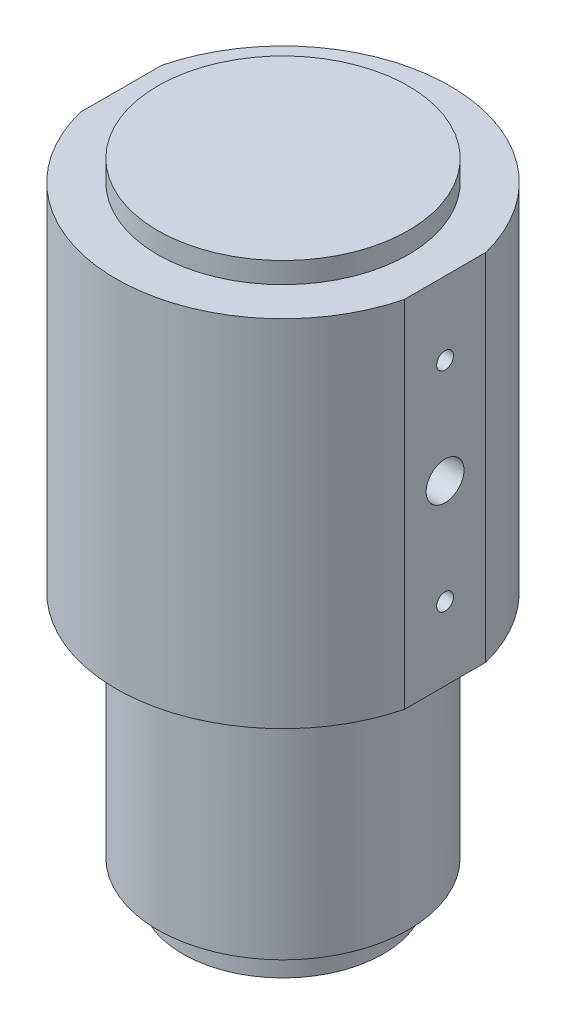
ISO-10303-21;
HEADER;
FILE_DESCRIPTION(('STEP AP214'),'2;1');
FILE_NAME('part.step','',(''),(''),'','','');
FILE_SCHEMA(('AUTOMOTIVE_DESIGN { 1 0 10303 214 1 1 1 1 }'));
ENDSEC;
DATA;
#1=APPLICATION_CONTEXT('core data for automotive mechanical design processes');
#2=APPLICATION_PROTOCOL_DEFINITION('international standard','automotive_design',2000,#1);
#3=PRODUCT_CONTEXT('',#1,'mechanical');
#4=PRODUCT('Part','Part','',(#3));
#5=PRODUCT_RELATED_PRODUCT_CATEGORY('part','',(#4));
#6=PRODUCT_DEFINITION_FORMATION('','',#4);
#7=PRODUCT_DEFINITION_CONTEXT('part definition',#1,'design');
#8=PRODUCT_DEFINITION('design','',#6,#7);
#9=PRODUCT_DEFINITION_SHAPE('','',#8);
#10=(LENGTH_UNIT() NAMED_UNIT(*) SI_UNIT(.MILLI.,.METRE.));
#11=(NAMED_UNIT(*) PLANE_ANGLE_UNIT() SI_UNIT($,.RADIAN.));
#12=(NAMED_UNIT(*) SI_UNIT($,.STERADIAN.) SOLID_ANGLE_UNIT());
#13=UNCERTAINTY_MEASURE_WITH_UNIT(LENGTH_MEASURE(1.E-05),#10,'distance_accuracy_value','');
#14=(GEOMETRIC_REPRESENTATION_CONTEXT(3) GLOBAL_UNCERTAINTY_ASSIGNED_CONTEXT((#13)) GLOBAL_UNIT_ASSIGNED_CONTEXT((#10,
#11,#12)) REPRESENTATION_CONTEXT('',''));
#15=CARTESIAN_POINT('',(0.,0.,0.));
#16=DIRECTION('',(0.,0.,1.));
#17=DIRECTION('',(1.,0.,0.));
#18=AXIS2_PLACEMENT_3D('',#15,#16,#17);
#19=CARTESIAN_POINT('',(0.,0.,0.));
#20=DIRECTION('',(0.,1.,0.));
#21=DIRECTION('',(0.,0.,1.));
#22=AXIS2_PLACEMENT_3D('',#19,#20,#21);
#23=PLANE('',#22);
#24=CARTESIAN_POINT('',(0.,0.,0.));
#25=DIRECTION('',(0.,1.,0.));
#26=DIRECTION('',(0.,0.,1.));
#27=AXIS2_PLACEMENT_3D('',#24,#25,#26);
#28=CIRCLE('',#27,38.1);
#29=CARTESIAN_POINT('',(0.,0.,38.1));
#30=VERTEX_POINT('',#29);
#31=EDGE_CURVE('E99',#30,#30,#28,.F.);
#32=ORIENTED_EDGE('',*,*,#31,.F.);
#33=EDGE_LOOP('',(#32));
#34=FACE_BOUND('',#33,.T.);
#35=DIRECTION('',(0.,0.,1.));
#36=VECTOR('',#35,1.);
#37=CARTESIAN_POINT('',(-49.276,0.,-63.5));
#38=LINE('',#37,#36);
#39=CARTESIAN_POINT('',(-49.276,0.,-12.3497297136416));
#40=VERTEX_POINT('',#39);
#41=CARTESIAN_POINT('',(-49.276,0.,12.3497297136416));
#42=VERTEX_POINT('',#41);
#43=EDGE_CURVE('E51',#40,#42,#38,.T.);
#44=ORIENTED_EDGE('',*,*,#43,.F.);
#45=CARTESIAN_POINT('',(0.,0.,0.));
#46=DIRECTION('',(0.,1.,0.));
#47=DIRECTION('',(0.,0.,1.));
#48=AXIS2_PLACEMENT_3D('',#45,#46,#47);
#49=CIRCLE('',#48,50.8);
#50=CARTESIAN_POINT('',(49.276,0.,-12.3497297136414));
#51=VERTEX_POINT('',#50);
#52=EDGE_CURVE('E97',#51,#40,#49,.T.);
#53=ORIENTED_EDGE('',*,*,#52,.F.);
#54=DIRECTION('',(0.,0.,-1.));
#55=VECTOR('',#54,1.);
#56=CARTESIAN_POINT('',(49.276,0.,-63.5));
#57=LINE('',#56,#55);
#58=CARTESIAN_POINT('',(49.276,0.,12.3497297136414));
#59=VERTEX_POINT('',#58);
#60=EDGE_CURVE('E59',#59,#51,#57,.T.);
#61=ORIENTED_EDGE('',*,*,#60,.F.);
#62=EDGE_CURVE('E92',#42,#59,#49,.T.);
#63=ORIENTED_EDGE('',*,*,#62,.F.);
#64=EDGE_LOOP('',(#44,#53,#61,#63));
#65=FACE_BOUND('',#64,.T.);
#66=ADVANCED_FACE('F37',(#34,#65),#23,.F.);
#67=CARTESIAN_POINT('',(0.,107.95,0.));
#68=DIRECTION('',(0.,1.,0.));
#69=DIRECTION('',(0.,0.,1.));
#70=AXIS2_PLACEMENT_3D('',#67,#68,#69);
#71=PLANE('',#70);
#72=CARTESIAN_POINT('',(0.,107.95,0.));
#73=DIRECTION('',(0.,1.,0.));
#74=DIRECTION('',(0.,0.,1.));
#75=AXIS2_PLACEMENT_3D('',#72,#73,#74);
#76=CIRCLE('',#75,38.1);
#77=CARTESIAN_POINT('',(0.,107.95,38.1));
#78=VERTEX_POINT('',#77);
#79=EDGE_CURVE('E103',#78,#78,#76,.T.);
#80=ORIENTED_EDGE('',*,*,#79,.F.);
#81=EDGE_LOOP('',(#80));
#82=FACE_BOUND('',#81,.T.);
#83=CARTESIAN_POINT('',(0.,107.95,0.));
#84=DIRECTION('',(0.,1.,0.));
#85=DIRECTION('',(0.,0.,1.));
#86=AXIS2_PLACEMENT_3D('',#83,#84,#85);
#87=CIRCLE('',#86,50.8);
#88=CARTESIAN_POINT('',(49.276,107.95,-12.3497297136414));
#89=VERTEX_POINT('',#88);
#90=CARTESIAN_POINT('',(-49.276,107.95,-12.3497297136416));
#91=VERTEX_POINT('',#90);
#92=EDGE_CURVE('E96',#89,#91,#87,.T.);
#93=ORIENTED_EDGE('',*,*,#92,.T.);
#94=DIRECTION('',(0.,0.,1.));
#95=VECTOR('',#94,1.);
#96=CARTESIAN_POINT('',(-49.276,107.95,-63.5));
#97=LINE('',#96,#95);
#98=CARTESIAN_POINT('',(-49.276,107.95,12.3497297136416));
#99=VERTEX_POINT('',#98);
#100=EDGE_CURVE('E84',#91,#99,#97,.T.);
#101=ORIENTED_EDGE('',*,*,#100,.T.);
#102=CARTESIAN_POINT('',(49.276,107.95,12.3497297136414));
#103=VERTEX_POINT('',#102);
#104=EDGE_CURVE('E90',#99,#103,#87,.T.);
#105=ORIENTED_EDGE('',*,*,#104,.T.);
#106=DIRECTION('',(0.,0.,-1.));
#107=VECTOR('',#106,1.);
#108=CARTESIAN_POINT('',(49.276,107.95,-63.5));
#109=LINE('',#108,#107);
#110=EDGE_CURVE('E75',#103,#89,#109,.T.);
#111=ORIENTED_EDGE('',*,*,#110,.T.);
#112=EDGE_LOOP('',(#93,#101,#105,#111));
#113=FACE_BOUND('',#112,.T.);
#114=ADVANCED_FACE('F95',(#82,#113),#71,.T.);
#115=CARTESIAN_POINT('',(0.,107.95,0.));
#116=DIRECTION('',(0.,-1.,0.));
#117=DIRECTION('',(0.,0.,-1.));
#118=AXIS2_PLACEMENT_3D('',#115,#116,#117);
#119=CYLINDRICAL_SURFACE('',#118,50.8);
#120=DIRECTION('',(0.,-1.,0.));
#121=VECTOR('',#120,1.);
#122=CARTESIAN_POINT('',(-49.276,107.95,-12.3497297136416));
#123=LINE('',#122,#121);
#124=EDGE_CURVE('E12',#91,#40,#123,.T.);
#125=ORIENTED_EDGE('',*,*,#124,.F.);
#126=ORIENTED_EDGE('',*,*,#92,.F.);
#127=DIRECTION('',(0.,-1.,0.));
#128=VECTOR('',#127,1.);
#129=CARTESIAN_POINT('',(49.276,107.95,-12.3497297136414));
#130=LINE('',#129,#128);
#131=EDGE_CURVE('E79',#51,#89,#130,.F.);
#132=ORIENTED_EDGE('',*,*,#131,.F.);
#133=ORIENTED_EDGE('',*,*,#52,.T.);
#134=EDGE_LOOP('',(#125,#126,#132,#133));
#135=FACE_BOUND('',#134,.T.);
#136=ADVANCED_FACE('F39',(#135),#119,.T.);
#137=DIRECTION('',(0.,-1.,0.));
#138=VECTOR('',#137,1.);
#139=CARTESIAN_POINT('',(-49.276,107.95,12.3497297136416));
#140=LINE('',#139,#138);
#141=EDGE_CURVE('E45',#42,#99,#140,.F.);
#142=ORIENTED_EDGE('',*,*,#141,.F.);
#143=ORIENTED_EDGE('',*,*,#62,.T.);
#144=DIRECTION('',(0.,-1.,0.));
#145=VECTOR('',#144,1.);
#146=CARTESIAN_POINT('',(49.276,107.95,12.3497297136414));
#147=LINE('',#146,#145);
#148=EDGE_CURVE('E78',#103,#59,#147,.T.);
#149=ORIENTED_EDGE('',*,*,#148,.F.);
#150=ORIENTED_EDGE('',*,*,#104,.F.);
#151=EDGE_LOOP('',(#142,#143,#149,#150));
#152=FACE_BOUND('',#151,.T.);
#153=ADVANCED_FACE('F89',(#152),#119,.T.);
#154=CARTESIAN_POINT('',(0.,-69.85,0.));
#155=DIRECTION('',(0.,-1.,0.));
#156=DIRECTION('',(0.,0.,-1.));
#157=AXIS2_PLACEMENT_3D('',#154,#155,#156);
#158=PLANE('',#157);
#159=CARTESIAN_POINT('',(0.,-69.85,0.));
#160=DIRECTION('',(0.,-1.,0.));
#161=DIRECTION('',(0.,0.,-1.));
#162=AXIS2_PLACEMENT_3D('',#159,#160,#161);
#163=CIRCLE('',#162,38.1);
#164=CARTESIAN_POINT('',(0.,-69.85,-38.1));
#165=VERTEX_POINT('',#164);
#166=EDGE_CURVE('E129',#165,#165,#163,.T.);
#167=ORIENTED_EDGE('',*,*,#166,.T.);
#168=EDGE_LOOP('',(#167));
#169=FACE_BOUND('',#168,.T.);
#170=CARTESIAN_POINT('',(0.,-69.85,0.));
#171=DIRECTION('',(0.,-1.,0.));
#172=DIRECTION('',(0.,0.,-1.));
#173=AXIS2_PLACEMENT_3D('',#170,#171,#172);
#174=CIRCLE('',#173,30.48);
#175=CARTESIAN_POINT('',(0.,-69.85,-30.48));
#176=VERTEX_POINT('',#175);
#177=EDGE_CURVE('E124',#176,#176,#174,.T.);
#178=ORIENTED_EDGE('',*,*,#177,.F.);
#179=EDGE_LOOP('',(#178));
#180=FACE_BOUND('',#179,.T.);
#181=ADVANCED_FACE('F153',(#169,#180),#158,.T.);
#182=CARTESIAN_POINT('',(0.,114.3,0.));
#183=DIRECTION('',(0.,-1.,0.));
#184=DIRECTION('',(0.,0.,-1.));
#185=AXIS2_PLACEMENT_3D('',#182,#183,#184);
#186=CYLINDRICAL_SURFACE('',#185,38.1);
#187=CARTESIAN_POINT('',(0.,114.3,0.));
#188=DIRECTION('',(0.,1.,0.));
#189=DIRECTION('',(0.,0.,1.));
#190=AXIS2_PLACEMENT_3D('',#187,#188,#189);
#191=CIRCLE('',#190,38.1);
#192=CARTESIAN_POINT('',(0.,114.3,38.1));
#193=VERTEX_POINT('',#192);
#194=EDGE_CURVE('E106',#193,#193,#191,.T.);
#195=ORIENTED_EDGE('',*,*,#194,.F.);
#196=EDGE_LOOP('',(#195));
#197=FACE_BOUND('',#196,.T.);
#198=ORIENTED_EDGE('',*,*,#79,.T.);
#199=EDGE_LOOP('',(#198));
#200=FACE_BOUND('',#199,.T.);
#201=ADVANCED_FACE('F139',(#197,#200),#186,.T.);
#202=CARTESIAN_POINT('',(0.,114.3,0.));
#203=DIRECTION('',(0.,1.,0.));
#204=DIRECTION('',(0.,0.,1.));
#205=AXIS2_PLACEMENT_3D('',#202,#203,#204);
#206=PLANE('',#205);
#207=ORIENTED_EDGE('',*,*,#194,.T.);
#208=EDGE_LOOP('',(#207));
#209=FACE_BOUND('',#208,.T.);
#210=ADVANCED_FACE('F152',(#209),#206,.T.);
#211=CARTESIAN_POINT('',(0.,-69.85,0.));
#212=DIRECTION('',(0.,1.,0.));
#213=DIRECTION('',(0.,0.,1.));
#214=AXIS2_PLACEMENT_3D('',#211,#212,#213);
#215=CYLINDRICAL_SURFACE('',#214,38.1);
#216=ORIENTED_EDGE('',*,*,#166,.F.);
#217=EDGE_LOOP('',(#216));
#218=FACE_BOUND('',#217,.T.);
#219=ORIENTED_EDGE('',*,*,#31,.T.);
#220=EDGE_LOOP('',(#219));
#221=FACE_BOUND('',#220,.T.);
#222=ADVANCED_FACE('F157',(#218,#221),#215,.T.);
#223=CARTESIAN_POINT('',(0.,-80.01,0.));
#224=DIRECTION('',(0.,1.,0.));
#225=DIRECTION('',(0.,0.,1.));
#226=AXIS2_PLACEMENT_3D('',#223,#224,#225);
#227=CYLINDRICAL_SURFACE('',#226,30.48);
#228=CARTESIAN_POINT('',(0.,-80.01,0.));
#229=DIRECTION('',(0.,-1.,0.));
#230=DIRECTION('',(0.,0.,-1.));
#231=AXIS2_PLACEMENT_3D('',#228,#229,#230);
#232=CIRCLE('',#231,30.48);
#233=CARTESIAN_POINT('',(0.,-80.01,-30.48));
#234=VERTEX_POINT('',#233);
#235=EDGE_CURVE('E126',#234,#234,#232,.T.);
#236=ORIENTED_EDGE('',*,*,#235,.F.);
#237=EDGE_LOOP('',(#236));
#238=FACE_BOUND('',#237,.T.);
#239=ORIENTED_EDGE('',*,*,#177,.T.);
#240=EDGE_LOOP('',(#239));
#241=FACE_BOUND('',#240,.T.);
#242=ADVANCED_FACE('F160',(#238,#241),#227,.T.);
#243=CARTESIAN_POINT('',(0.,-80.01,0.));
#244=DIRECTION('',(0.,-1.,0.));
#245=DIRECTION('',(0.,0.,-1.));
#246=AXIS2_PLACEMENT_3D('',#243,#244,#245);
#247=PLANE('',#246);
#248=CARTESIAN_POINT('',(0.,-80.01,0.));
#249=DIRECTION('',(0.,-1.,0.));
#250=DIRECTION('',(0.,0.,-1.));
#251=AXIS2_PLACEMENT_3D('',#248,#249,#250);
#252=CIRCLE('',#251,15.875);
#253=CARTESIAN_POINT('',(0.,-80.01,-15.875));
#254=VERTEX_POINT('',#253);
#255=EDGE_CURVE('E113',#254,#254,#252,.T.);
#256=ORIENTED_EDGE('',*,*,#255,.F.);
#257=EDGE_LOOP('',(#256));
#258=FACE_BOUND('',#257,.T.);
#259=ORIENTED_EDGE('',*,*,#235,.T.);
#260=EDGE_LOOP('',(#259));
#261=FACE_BOUND('',#260,.T.);
#262=ADVANCED_FACE('F167',(#258,#261),#247,.T.);
#263=CARTESIAN_POINT('',(0.,2.54,0.));
#264=DIRECTION('',(0.,-1.,0.));
#265=DIRECTION('',(0.,0.,-1.));
#266=AXIS2_PLACEMENT_3D('',#263,#264,#265);
#267=CYLINDRICAL_SURFACE('',#266,15.875);
#268=CARTESIAN_POINT('',(0.,2.54,0.));
#269=DIRECTION('',(0.,-1.,0.));
#270=DIRECTION('',(0.,0.,-1.));
#271=AXIS2_PLACEMENT_3D('',#268,#269,#270);
#272=CIRCLE('',#271,15.875);
#273=CARTESIAN_POINT('',(0.,2.54,-15.875));
#274=VERTEX_POINT('',#273);
#275=EDGE_CURVE('E116',#274,#274,#272,.T.);
#276=ORIENTED_EDGE('',*,*,#275,.F.);
#277=EDGE_LOOP('',(#276));
#278=FACE_BOUND('',#277,.T.);
#279=ORIENTED_EDGE('',*,*,#255,.T.);
#280=EDGE_LOOP('',(#279));
#281=FACE_BOUND('',#280,.T.);
#282=ADVANCED_FACE('F171',(#278,#281),#267,.F.);
#283=CARTESIAN_POINT('',(0.,2.54,0.));
#284=DIRECTION('',(0.,-1.,0.));
#285=DIRECTION('',(0.,0.,-1.));
#286=AXIS2_PLACEMENT_3D('',#283,#284,#285);
#287=PLANE('',#286);
#288=ORIENTED_EDGE('',*,*,#275,.T.);
#289=EDGE_LOOP('',(#288));
#290=FACE_BOUND('',#289,.T.);
#291=ADVANCED_FACE('F175',(#290),#287,.T.);
#292=CARTESIAN_POINT('',(49.276,0.,-63.5));
#293=DIRECTION('',(1.,0.,0.));
#294=DIRECTION('',(0.,0.,-1.));
#295=AXIS2_PLACEMENT_3D('',#292,#293,#294);
#296=PLANE('',#295);
#297=CARTESIAN_POINT('',(49.276,85.725,0.));
#298=DIRECTION('',(-1.,0.,0.));
#299=DIRECTION('',(0.,0.,1.));
#300=AXIS2_PLACEMENT_3D('',#297,#298,#299);
#301=CIRCLE('',#300,2.55269999999999);
#302=CARTESIAN_POINT('',(49.276,85.725,2.55269999999999));
#303=VERTEX_POINT('',#302);
#304=EDGE_CURVE('E202',#303,#303,#301,.T.);
#305=ORIENTED_EDGE('',*,*,#304,.T.);
#306=EDGE_LOOP('',(#305));
#307=FACE_BOUND('',#306,.T.);
#308=CARTESIAN_POINT('',(49.276,22.225,0.));
#309=DIRECTION('',(-1.,0.,0.));
#310=DIRECTION('',(0.,0.,1.));
#311=AXIS2_PLACEMENT_3D('',#308,#309,#310);
#312=CIRCLE('',#311,2.55269999999999);
#313=CARTESIAN_POINT('',(49.276,22.225,2.5527));
#314=VERTEX_POINT('',#313);
#315=EDGE_CURVE('E212',#314,#314,#312,.T.);
#316=ORIENTED_EDGE('',*,*,#315,.T.);
#317=EDGE_LOOP('',(#316));
#318=FACE_BOUND('',#317,.T.);
#319=CARTESIAN_POINT('',(49.276,53.975,0.));
#320=DIRECTION('',(-1.,0.,0.));
#321=DIRECTION('',(0.,0.,1.));
#322=AXIS2_PLACEMENT_3D('',#319,#320,#321);
#323=CIRCLE('',#322,5.75436999999998);
#324=CARTESIAN_POINT('',(49.276,53.975,5.75436999999998));
#325=VERTEX_POINT('',#324);
#326=EDGE_CURVE('E121',#325,#325,#323,.T.);
#327=ORIENTED_EDGE('',*,*,#326,.T.);
#328=EDGE_LOOP('',(#327));
#329=FACE_BOUND('',#328,.T.);
#330=ORIENTED_EDGE('',*,*,#148,.T.);
#331=ORIENTED_EDGE('',*,*,#60,.T.);
#332=ORIENTED_EDGE('',*,*,#131,.T.);
#333=ORIENTED_EDGE('',*,*,#110,.F.);
#334=EDGE_LOOP('',(#330,#331,#332,#333));
#335=FACE_BOUND('',#334,.T.);
#336=ADVANCED_FACE('F77',(#307,#318,#329,#335),#296,.T.);
#337=CARTESIAN_POINT('',(-49.276,0.,-63.5));
#338=DIRECTION('',(-1.,0.,0.));
#339=DIRECTION('',(0.,0.,1.));
#340=AXIS2_PLACEMENT_3D('',#337,#338,#339);
#341=PLANE('',#340);
#342=CARTESIAN_POINT('',(-49.276,85.725,0.));
#343=DIRECTION('',(-1.,0.,0.));
#344=DIRECTION('',(0.,0.,1.));
#345=AXIS2_PLACEMENT_3D('',#342,#343,#344);
#346=CIRCLE('',#345,2.55269999999999);
#347=CARTESIAN_POINT('',(-49.276,85.725,2.55269999999999));
#348=VERTEX_POINT('',#347);
#349=EDGE_CURVE('E205',#348,#348,#346,.T.);
#350=ORIENTED_EDGE('',*,*,#349,.F.);
#351=EDGE_LOOP('',(#350));
#352=FACE_BOUND('',#351,.T.);
#353=CARTESIAN_POINT('',(-49.276,22.225,0.));
#354=DIRECTION('',(-1.,0.,0.));
#355=DIRECTION('',(0.,0.,1.));
#356=AXIS2_PLACEMENT_3D('',#353,#354,#355);
#357=CIRCLE('',#356,2.55269999999999);
#358=CARTESIAN_POINT('',(-49.276,22.225,2.5527));
#359=VERTEX_POINT('',#358);
#360=EDGE_CURVE('E207',#359,#359,#357,.T.);
#361=ORIENTED_EDGE('',*,*,#360,.F.);
#362=EDGE_LOOP('',(#361));
#363=FACE_BOUND('',#362,.T.);
#364=CARTESIAN_POINT('',(-49.276,53.975,0.));
#365=DIRECTION('',(-1.,0.,0.));
#366=DIRECTION('',(0.,0.,1.));
#367=AXIS2_PLACEMENT_3D('',#364,#365,#366);
#368=CIRCLE('',#367,5.75436999999999);
#369=CARTESIAN_POINT('',(-49.276,53.975,5.75436999999999));
#370=VERTEX_POINT('',#369);
#371=EDGE_CURVE('E215',#370,#370,#368,.T.);
#372=ORIENTED_EDGE('',*,*,#371,.F.);
#373=EDGE_LOOP('',(#372));
#374=FACE_BOUND('',#373,.T.);
#375=ORIENTED_EDGE('',*,*,#124,.T.);
#376=ORIENTED_EDGE('',*,*,#43,.T.);
#377=ORIENTED_EDGE('',*,*,#141,.T.);
#378=ORIENTED_EDGE('',*,*,#100,.F.);
#379=EDGE_LOOP('',(#375,#376,#377,#378));
#380=FACE_BOUND('',#379,.T.);
#381=ADVANCED_FACE('F109',(#352,#363,#374,#380),#341,.T.);
#382=CARTESIAN_POINT('',(-49.276,53.975,0.));
#383=DIRECTION('',(-1.,0.,0.));
#384=DIRECTION('',(0.,0.,1.));
#385=AXIS2_PLACEMENT_3D('',#382,#383,#384);
#386=CYLINDRICAL_SURFACE('',#385,5.75436999999998);
#387=ORIENTED_EDGE('',*,*,#326,.F.);
#388=EDGE_LOOP('',(#387));
#389=FACE_BOUND('',#388,.T.);
#390=ORIENTED_EDGE('',*,*,#371,.T.);
#391=EDGE_LOOP('',(#390));
#392=FACE_BOUND('',#391,.T.);
#393=ADVANCED_FACE('F182',(#389,#392),#386,.F.);
#394=CARTESIAN_POINT('',(-49.276,22.225,0.));
#395=DIRECTION('',(-1.,0.,0.));
#396=DIRECTION('',(0.,0.,1.));
#397=AXIS2_PLACEMENT_3D('',#394,#395,#396);
#398=CYLINDRICAL_SURFACE('',#397,2.55269999999999);
#399=ORIENTED_EDGE('',*,*,#315,.F.);
#400=EDGE_LOOP('',(#399));
#401=FACE_BOUND('',#400,.T.);
#402=ORIENTED_EDGE('',*,*,#360,.T.);
#403=EDGE_LOOP('',(#402));
#404=FACE_BOUND('',#403,.T.);
#405=ADVANCED_FACE('F189',(#401,#404),#398,.F.);
#406=CARTESIAN_POINT('',(-49.276,85.725,0.));
#407=DIRECTION('',(-1.,0.,0.));
#408=DIRECTION('',(0.,0.,1.));
#409=AXIS2_PLACEMENT_3D('',#406,#407,#408);
#410=CYLINDRICAL_SURFACE('',#409,2.55269999999999);
#411=ORIENTED_EDGE('',*,*,#304,.F.);
#412=EDGE_LOOP('',(#411));
#413=FACE_BOUND('',#412,.T.);
#414=ORIENTED_EDGE('',*,*,#349,.T.);
#415=EDGE_LOOP('',(#414));
#416=FACE_BOUND('',#415,.T.);
#417=ADVANCED_FACE('F193',(#413,#416),#410,.F.);
#418=CLOSED_SHELL('',(#66,#114,#136,#153,#181,#201,#210,#222,#242,#262,#282,#291,#336,#381,#393,
#405,#417));
#419=MANIFOLD_SOLID_BREP('B2',#418);
#420=ADVANCED_BREP_SHAPE_REPRESENTATION('',(#18,#419),#14);
#421=SHAPE_DEFINITION_REPRESENTATION(#9,#420);
ENDSEC;
END-ISO-10303-21;
